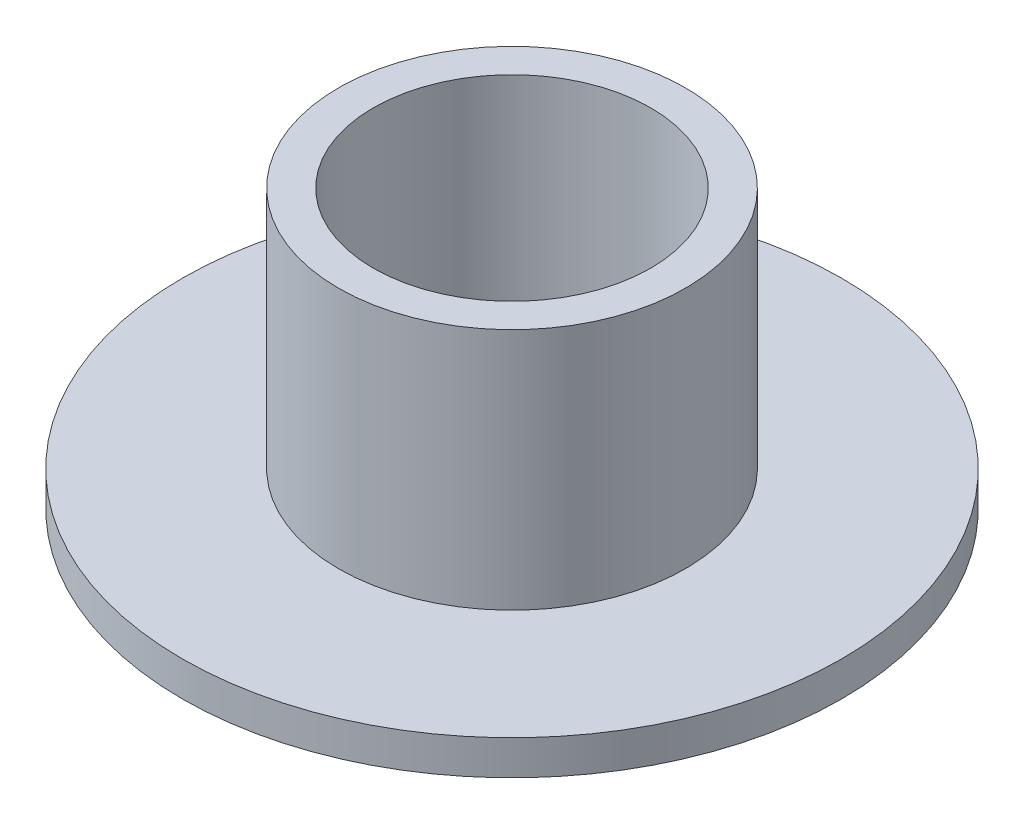
ISO-10303-21;
HEADER;
FILE_DESCRIPTION(('STEP AP214'),'2;1');
FILE_NAME('part.step','',(''),(''),'','','');
FILE_SCHEMA(('AUTOMOTIVE_DESIGN { 1 0 10303 214 1 1 1 1 }'));
ENDSEC;
DATA;
#1=APPLICATION_CONTEXT('core data for automotive mechanical design processes');
#2=APPLICATION_PROTOCOL_DEFINITION('international standard','automotive_design',2000,#1);
#3=PRODUCT_CONTEXT('',#1,'mechanical');
#4=PRODUCT('Part','Part','',(#3));
#5=PRODUCT_RELATED_PRODUCT_CATEGORY('part','',(#4));
#6=PRODUCT_DEFINITION_FORMATION('','',#4);
#7=PRODUCT_DEFINITION_CONTEXT('part definition',#1,'design');
#8=PRODUCT_DEFINITION('design','',#6,#7);
#9=PRODUCT_DEFINITION_SHAPE('','',#8);
#10=(LENGTH_UNIT() NAMED_UNIT(*) SI_UNIT(.MILLI.,.METRE.));
#11=(NAMED_UNIT(*) PLANE_ANGLE_UNIT() SI_UNIT($,.RADIAN.));
#12=(NAMED_UNIT(*) SI_UNIT($,.STERADIAN.) SOLID_ANGLE_UNIT());
#13=UNCERTAINTY_MEASURE_WITH_UNIT(LENGTH_MEASURE(1.E-05),#10,'distance_accuracy_value','');
#14=(GEOMETRIC_REPRESENTATION_CONTEXT(3) GLOBAL_UNCERTAINTY_ASSIGNED_CONTEXT((#13)) GLOBAL_UNIT_ASSIGNED_CONTEXT((#10,
#11,#12)) REPRESENTATION_CONTEXT('',''));
#15=CARTESIAN_POINT('',(0.,0.,0.));
#16=DIRECTION('',(0.,0.,1.));
#17=DIRECTION('',(1.,0.,0.));
#18=AXIS2_PLACEMENT_3D('',#15,#16,#17);
#19=CARTESIAN_POINT('',(0.,0.5,0.));
#20=DIRECTION('',(0.,-1.,0.));
#21=DIRECTION('',(0.,0.,-1.));
#22=AXIS2_PLACEMENT_3D('',#19,#20,#21);
#23=CYLINDRICAL_SURFACE('',#22,4.75);
#24=CARTESIAN_POINT('',(0.,0.5,0.));
#25=DIRECTION('',(0.,1.,0.));
#26=DIRECTION('',(0.,0.,1.));
#27=AXIS2_PLACEMENT_3D('',#24,#25,#26);
#28=CIRCLE('',#27,4.75);
#29=CARTESIAN_POINT('',(0.,0.5,4.75));
#30=VERTEX_POINT('',#29);
#31=EDGE_CURVE('E45',#30,#30,#28,.T.);
#32=ORIENTED_EDGE('',*,*,#31,.F.);
#33=EDGE_LOOP('',(#32));
#34=FACE_BOUND('',#33,.T.);
#35=CARTESIAN_POINT('',(0.,0.,0.));
#36=DIRECTION('',(0.,1.,0.));
#37=DIRECTION('',(0.,0.,1.));
#38=AXIS2_PLACEMENT_3D('',#35,#36,#37);
#39=CIRCLE('',#38,4.75);
#40=CARTESIAN_POINT('',(0.,0.,4.75));
#41=VERTEX_POINT('',#40);
#42=EDGE_CURVE('E41',#41,#41,#39,.T.);
#43=ORIENTED_EDGE('',*,*,#42,.T.);
#44=EDGE_LOOP('',(#43));
#45=FACE_BOUND('',#44,.T.);
#46=ADVANCED_FACE('F38',(#34,#45),#23,.T.);
#47=CARTESIAN_POINT('',(0.,0.5,0.));
#48=DIRECTION('',(0.,1.,0.));
#49=DIRECTION('',(0.,0.,1.));
#50=AXIS2_PLACEMENT_3D('',#47,#48,#49);
#51=PLANE('',#50);
#52=CARTESIAN_POINT('',(0.,0.5,0.));
#53=DIRECTION('',(0.,1.,0.));
#54=DIRECTION('',(0.,0.,1.));
#55=AXIS2_PLACEMENT_3D('',#52,#53,#54);
#56=CIRCLE('',#55,2.5);
#57=CARTESIAN_POINT('',(0.,0.5,2.5));
#58=VERTEX_POINT('',#57);
#59=EDGE_CURVE('E10',#58,#58,#56,.T.);
#60=ORIENTED_EDGE('',*,*,#59,.F.);
#61=EDGE_LOOP('',(#60));
#62=FACE_BOUND('',#61,.T.);
#63=ORIENTED_EDGE('',*,*,#31,.T.);
#64=EDGE_LOOP('',(#63));
#65=FACE_BOUND('',#64,.T.);
#66=ADVANCED_FACE('F74',(#62,#65),#51,.T.);
#67=CARTESIAN_POINT('',(0.,0.,0.));
#68=DIRECTION('',(0.,1.,0.));
#69=DIRECTION('',(0.,0.,1.));
#70=AXIS2_PLACEMENT_3D('',#67,#68,#69);
#71=PLANE('',#70);
#72=CARTESIAN_POINT('',(0.,0.,0.));
#73=DIRECTION('',(0.,-1.,0.));
#74=DIRECTION('',(0.,0.,-1.));
#75=AXIS2_PLACEMENT_3D('',#72,#73,#74);
#76=CIRCLE('',#75,2.);
#77=CARTESIAN_POINT('',(0.,0.,-2.));
#78=VERTEX_POINT('',#77);
#79=EDGE_CURVE('E55',#78,#78,#76,.T.);
#80=ORIENTED_EDGE('',*,*,#79,.F.);
#81=EDGE_LOOP('',(#80));
#82=FACE_BOUND('',#81,.T.);
#83=ORIENTED_EDGE('',*,*,#42,.F.);
#84=EDGE_LOOP('',(#83));
#85=FACE_BOUND('',#84,.T.);
#86=ADVANCED_FACE('F70',(#82,#85),#71,.F.);
#87=CARTESIAN_POINT('',(0.,4.,0.));
#88=DIRECTION('',(0.,-1.,0.));
#89=DIRECTION('',(0.,0.,-1.));
#90=AXIS2_PLACEMENT_3D('',#87,#88,#89);
#91=CYLINDRICAL_SURFACE('',#90,2.5);
#92=CARTESIAN_POINT('',(0.,4.,0.));
#93=DIRECTION('',(0.,1.,0.));
#94=DIRECTION('',(0.,0.,1.));
#95=AXIS2_PLACEMENT_3D('',#92,#93,#94);
#96=CIRCLE('',#95,2.5);
#97=CARTESIAN_POINT('',(0.,4.,2.5));
#98=VERTEX_POINT('',#97);
#99=EDGE_CURVE('E51',#98,#98,#96,.T.);
#100=ORIENTED_EDGE('',*,*,#99,.F.);
#101=EDGE_LOOP('',(#100));
#102=FACE_BOUND('',#101,.T.);
#103=ORIENTED_EDGE('',*,*,#59,.T.);
#104=EDGE_LOOP('',(#103));
#105=FACE_BOUND('',#104,.T.);
#106=ADVANCED_FACE('F73',(#102,#105),#91,.T.);
#107=CARTESIAN_POINT('',(0.,4.,0.));
#108=DIRECTION('',(0.,1.,0.));
#109=DIRECTION('',(0.,0.,1.));
#110=AXIS2_PLACEMENT_3D('',#107,#108,#109);
#111=PLANE('',#110);
#112=CARTESIAN_POINT('',(0.,4.,0.));
#113=DIRECTION('',(0.,-1.,0.));
#114=DIRECTION('',(0.,0.,-1.));
#115=AXIS2_PLACEMENT_3D('',#112,#113,#114);
#116=CIRCLE('',#115,2.);
#117=CARTESIAN_POINT('',(0.,4.,-2.));
#118=VERTEX_POINT('',#117);
#119=EDGE_CURVE('E54',#118,#118,#116,.T.);
#120=ORIENTED_EDGE('',*,*,#119,.T.);
#121=EDGE_LOOP('',(#120));
#122=FACE_BOUND('',#121,.T.);
#123=ORIENTED_EDGE('',*,*,#99,.T.);
#124=EDGE_LOOP('',(#123));
#125=FACE_BOUND('',#124,.T.);
#126=ADVANCED_FACE('F61',(#122,#125),#111,.T.);
#127=CARTESIAN_POINT('',(0.,4.,0.));
#128=DIRECTION('',(0.,-1.,0.));
#129=DIRECTION('',(0.,0.,-1.));
#130=AXIS2_PLACEMENT_3D('',#127,#128,#129);
#131=CYLINDRICAL_SURFACE('',#130,2.);
#132=ORIENTED_EDGE('',*,*,#119,.F.);
#133=EDGE_LOOP('',(#132));
#134=FACE_BOUND('',#133,.T.);
#135=ORIENTED_EDGE('',*,*,#79,.T.);
#136=EDGE_LOOP('',(#135));
#137=FACE_BOUND('',#136,.T.);
#138=ADVANCED_FACE('F64',(#134,#137),#131,.F.);
#139=CLOSED_SHELL('',(#46,#66,#86,#106,#126,#138));
#140=MANIFOLD_SOLID_BREP('B2',#139);
#141=ADVANCED_BREP_SHAPE_REPRESENTATION('',(#18,#140),#14);
#142=SHAPE_DEFINITION_REPRESENTATION(#9,#141);
ENDSEC;
END-ISO-10303-21;
